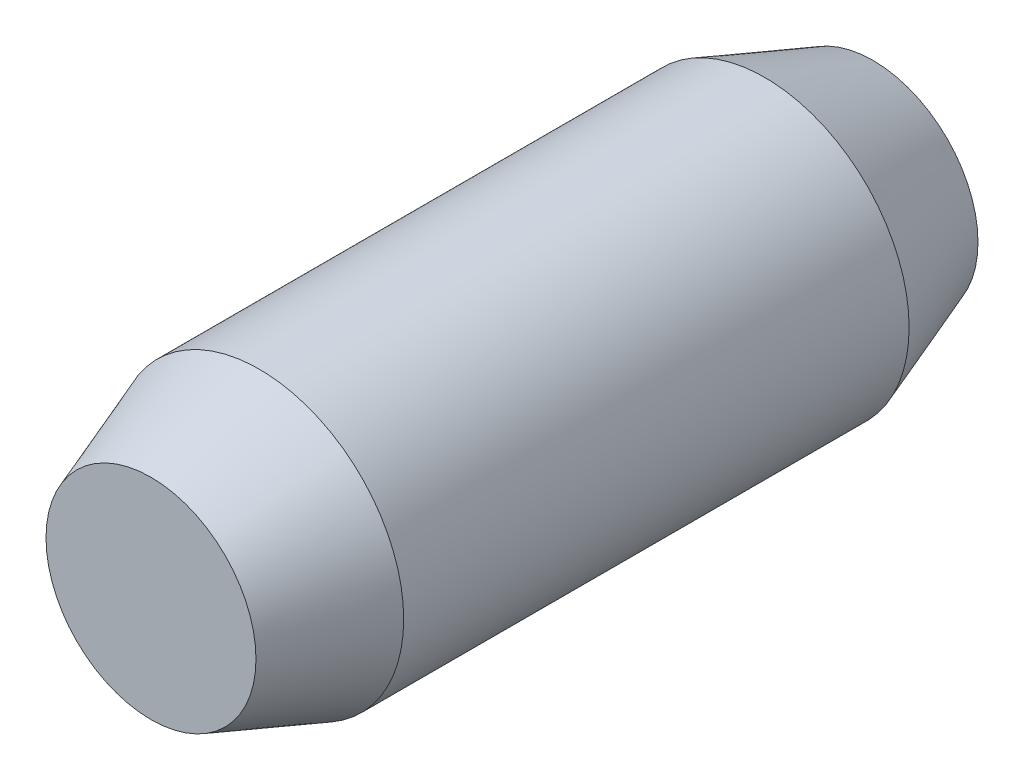
ISO-10303-21;
HEADER;
FILE_DESCRIPTION(('STEP AP214'),'2;1');
FILE_NAME('part.step','',(''),(''),'','','');
FILE_SCHEMA(('AUTOMOTIVE_DESIGN { 1 0 10303 214 1 1 1 1 }'));
ENDSEC;
DATA;
#1=APPLICATION_CONTEXT('core data for automotive mechanical design processes');
#2=APPLICATION_PROTOCOL_DEFINITION('international standard','automotive_design',2000,#1);
#3=PRODUCT_CONTEXT('',#1,'mechanical');
#4=PRODUCT('Part','Part','',(#3));
#5=PRODUCT_RELATED_PRODUCT_CATEGORY('part','',(#4));
#6=PRODUCT_DEFINITION_FORMATION('','',#4);
#7=PRODUCT_DEFINITION_CONTEXT('part definition',#1,'design');
#8=PRODUCT_DEFINITION('design','',#6,#7);
#9=PRODUCT_DEFINITION_SHAPE('','',#8);
#10=(LENGTH_UNIT() NAMED_UNIT(*) SI_UNIT(.MILLI.,.METRE.));
#11=(NAMED_UNIT(*) PLANE_ANGLE_UNIT() SI_UNIT($,.RADIAN.));
#12=(NAMED_UNIT(*) SI_UNIT($,.STERADIAN.) SOLID_ANGLE_UNIT());
#13=UNCERTAINTY_MEASURE_WITH_UNIT(LENGTH_MEASURE(1.E-05),#10,'distance_accuracy_value','');
#14=(GEOMETRIC_REPRESENTATION_CONTEXT(3) GLOBAL_UNCERTAINTY_ASSIGNED_CONTEXT((#13)) GLOBAL_UNIT_ASSIGNED_CONTEXT((#10,
#11,#12)) REPRESENTATION_CONTEXT('',''));
#15=CARTESIAN_POINT('',(0.,0.,0.));
#16=DIRECTION('',(0.,0.,1.));
#17=DIRECTION('',(1.,0.,0.));
#18=AXIS2_PLACEMENT_3D('',#15,#16,#17);
#19=CARTESIAN_POINT('',(4.44089209850063E-13,-3.33066907387547E-13,20.));
#20=DIRECTION('',(0.,0.,-1.));
#21=DIRECTION('',(-1.,0.,0.));
#22=AXIS2_PLACEMENT_3D('',#19,#20,#21);
#23=CYLINDRICAL_SURFACE('',#22,4.);
#24=CARTESIAN_POINT('',(4.44089209850063E-13,-3.33066907387547E-13,3.00000000000011));
#25=DIRECTION('',(0.,0.,1.));
#26=DIRECTION('',(1.,0.,0.));
#27=AXIS2_PLACEMENT_3D('',#24,#25,#26);
#28=CIRCLE('',#27,4.);
#29=CARTESIAN_POINT('',(4.00000000000045,-3.33510996597397E-13,3.00000000000011));
#30=VERTEX_POINT('',#29);
#31=EDGE_CURVE('E53',#30,#30,#28,.T.);
#32=ORIENTED_EDGE('',*,*,#31,.T.);
#33=EDGE_LOOP('',(#32));
#34=FACE_BOUND('',#33,.T.);
#35=CARTESIAN_POINT('',(4.44089209850063E-13,-3.33066907387547E-13,16.9999999999999));
#36=DIRECTION('',(0.,0.,1.));
#37=DIRECTION('',(1.,0.,0.));
#38=AXIS2_PLACEMENT_3D('',#35,#36,#37);
#39=CIRCLE('',#38,4.);
#40=CARTESIAN_POINT('',(4.00000000000045,-3.33510996597397E-13,16.9999999999999));
#41=VERTEX_POINT('',#40);
#42=EDGE_CURVE('E57',#41,#41,#39,.F.);
#43=ORIENTED_EDGE('',*,*,#42,.T.);
#44=EDGE_LOOP('',(#43));
#45=FACE_BOUND('',#44,.T.);
#46=ADVANCED_FACE('F46',(#34,#45),#23,.T.);
#47=CARTESIAN_POINT('',(4.44089209850063E-13,-3.33066907387547E-13,20.));
#48=DIRECTION('',(0.,0.,1.));
#49=DIRECTION('',(1.,0.,0.));
#50=AXIS2_PLACEMENT_3D('',#47,#48,#49);
#51=PLANE('',#50);
#52=CARTESIAN_POINT('',(4.44089209850063E-13,-3.33066907387547E-13,20.));
#53=DIRECTION('',(0.,0.,1.));
#54=DIRECTION('',(1.,0.,0.));
#55=AXIS2_PLACEMENT_3D('',#52,#53,#54);
#56=CIRCLE('',#55,2.90808929720139);
#57=CARTESIAN_POINT('',(2.90808929720184,-3.33389770157089E-13,20.));
#58=VERTEX_POINT('',#57);
#59=EDGE_CURVE('E61',#58,#58,#56,.T.);
#60=ORIENTED_EDGE('',*,*,#59,.T.);
#61=EDGE_LOOP('',(#60));
#62=FACE_BOUND('',#61,.T.);
#63=ADVANCED_FACE('F67',(#62),#51,.T.);
#64=CARTESIAN_POINT('',(4.44089209850063E-13,-3.33066907387547E-13,0.));
#65=DIRECTION('',(0.,0.,1.));
#66=DIRECTION('',(1.,0.,0.));
#67=AXIS2_PLACEMENT_3D('',#64,#65,#66);
#68=PLANE('',#67);
#69=CARTESIAN_POINT('',(4.44089209850063E-13,-3.33066907387547E-13,0.));
#70=DIRECTION('',(0.,0.,1.));
#71=DIRECTION('',(1.,0.,0.));
#72=AXIS2_PLACEMENT_3D('',#69,#70,#71);
#73=CIRCLE('',#72,2.90808929720139);
#74=CARTESIAN_POINT('',(2.90808929720184,-3.33389770157089E-13,0.));
#75=VERTEX_POINT('',#74);
#76=EDGE_CURVE('E12',#75,#75,#73,.F.);
#77=ORIENTED_EDGE('',*,*,#76,.T.);
#78=EDGE_LOOP('',(#77));
#79=FACE_BOUND('',#78,.T.);
#80=ADVANCED_FACE('F71',(#79),#68,.F.);
#81=CARTESIAN_POINT('',(4.44089209850063E-13,-3.33066907387547E-13,20.));
#82=DIRECTION('',(0.,0.,-1.));
#83=DIRECTION('',(-1.,0.,0.));
#84=AXIS2_PLACEMENT_3D('',#81,#82,#83);
#85=CONICAL_SURFACE('',#84,2.90808929720139,0.349065850398863);
#86=ORIENTED_EDGE('',*,*,#42,.F.);
#87=EDGE_LOOP('',(#86));
#88=FACE_BOUND('',#87,.T.);
#89=ORIENTED_EDGE('',*,*,#59,.F.);
#90=EDGE_LOOP('',(#89));
#91=FACE_BOUND('',#90,.T.);
#92=ADVANCED_FACE('F69',(#88,#91),#85,.T.);
#93=CARTESIAN_POINT('',(4.44089209850063E-13,-3.33066907387547E-13,3.00000000000011));
#94=DIRECTION('',(0.,0.,1.));
#95=DIRECTION('',(1.,0.,0.));
#96=AXIS2_PLACEMENT_3D('',#93,#94,#95);
#97=CONICAL_SURFACE('',#96,4.,0.349065850398864);
#98=ORIENTED_EDGE('',*,*,#76,.F.);
#99=EDGE_LOOP('',(#98));
#100=FACE_BOUND('',#99,.T.);
#101=ORIENTED_EDGE('',*,*,#31,.F.);
#102=EDGE_LOOP('',(#101));
#103=FACE_BOUND('',#102,.T.);
#104=ADVANCED_FACE('F48',(#100,#103),#97,.T.);
#105=CLOSED_SHELL('',(#46,#63,#80,#92,#104));
#106=MANIFOLD_SOLID_BREP('B2',#105);
#107=ADVANCED_BREP_SHAPE_REPRESENTATION('',(#18,#106),#14);
#108=SHAPE_DEFINITION_REPRESENTATION(#9,#107);
ENDSEC;
END-ISO-10303-21;
